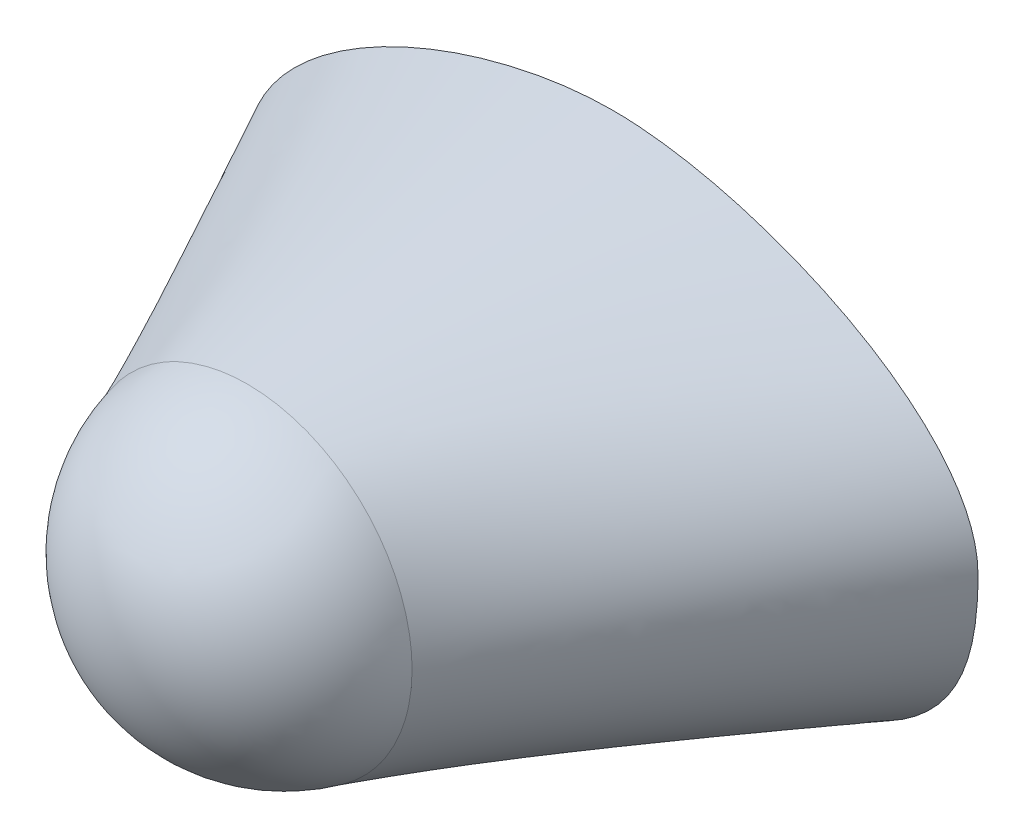
ISO-10303-21;
HEADER;
FILE_DESCRIPTION(('STEP AP214'),'2;1');
FILE_NAME('part.step','',(''),(''),'','','');
FILE_SCHEMA(('AUTOMOTIVE_DESIGN { 1 0 10303 214 1 1 1 1 }'));
ENDSEC;
DATA;
#1=APPLICATION_CONTEXT('core data for automotive mechanical design processes');
#2=APPLICATION_PROTOCOL_DEFINITION('international standard','automotive_design',2000,#1);
#3=PRODUCT_CONTEXT('',#1,'mechanical');
#4=PRODUCT('Part','Part','',(#3));
#5=PRODUCT_RELATED_PRODUCT_CATEGORY('part','',(#4));
#6=PRODUCT_DEFINITION_FORMATION('','',#4);
#7=PRODUCT_DEFINITION_CONTEXT('part definition',#1,'design');
#8=PRODUCT_DEFINITION('design','',#6,#7);
#9=PRODUCT_DEFINITION_SHAPE('','',#8);
#10=(LENGTH_UNIT() NAMED_UNIT(*) SI_UNIT(.MILLI.,.METRE.));
#11=(NAMED_UNIT(*) PLANE_ANGLE_UNIT() SI_UNIT($,.RADIAN.));
#12=(NAMED_UNIT(*) SI_UNIT($,.STERADIAN.) SOLID_ANGLE_UNIT());
#13=UNCERTAINTY_MEASURE_WITH_UNIT(LENGTH_MEASURE(1.E-05),#10,'distance_accuracy_value','');
#14=(GEOMETRIC_REPRESENTATION_CONTEXT(3) GLOBAL_UNCERTAINTY_ASSIGNED_CONTEXT((#13)) GLOBAL_UNIT_ASSIGNED_CONTEXT((#10,
#11,#12)) REPRESENTATION_CONTEXT('',''));
#15=CARTESIAN_POINT('',(0.,0.,0.));
#16=DIRECTION('',(0.,0.,1.));
#17=DIRECTION('',(1.,0.,0.));
#18=AXIS2_PLACEMENT_3D('',#15,#16,#17);
#19=CARTESIAN_POINT('',(-41.25,-21.25,0.));
#20=DIRECTION('',(0.,0.,-1.));
#21=DIRECTION('',(-1.,0.,0.));
#22=AXIS2_PLACEMENT_3D('',#19,#20,#21);
#23=PLANE('',#22);
#24=CARTESIAN_POINT('',(-50.,0.,0.));
#25=CARTESIAN_POINT('',(-50.,-16.6666666666667,0.));
#26=CARTESIAN_POINT('',(-43.3333333333334,-30.,0.));
#27=CARTESIAN_POINT('',(0.,-30.,0.));
#28=B_SPLINE_CURVE_WITH_KNOTS('',3,(#24,#25,#26,#27),.UNSPECIFIED.,.F.,.F.,(4,4),(0.,1.),.UNSPECIFIED.);
#29=CARTESIAN_POINT('',(-50.,0.,0.));
#30=VERTEX_POINT('',#29);
#31=CARTESIAN_POINT('',(0.,-30.,0.));
#32=VERTEX_POINT('',#31);
#33=EDGE_CURVE('E147',#30,#32,#28,.T.);
#34=ORIENTED_EDGE('',*,*,#33,.F.);
#35=CARTESIAN_POINT('',(0.,30.,0.));
#36=CARTESIAN_POINT('',(-20.,30.,0.));
#37=CARTESIAN_POINT('',(-50.,16.6666666666667,0.));
#38=CARTESIAN_POINT('',(-50.,0.,0.));
#39=B_SPLINE_CURVE_WITH_KNOTS('',3,(#35,#36,#37,#38),.UNSPECIFIED.,.F.,.F.,(4,4),(0.,1.),.UNSPECIFIED.);
#40=CARTESIAN_POINT('',(0.,30.,0.));
#41=VERTEX_POINT('',#40);
#42=EDGE_CURVE('E125',#41,#30,#39,.T.);
#43=ORIENTED_EDGE('',*,*,#42,.F.);
#44=CARTESIAN_POINT('',(50.,0.,0.));
#45=CARTESIAN_POINT('',(50.,16.6666666666667,0.));
#46=CARTESIAN_POINT('',(20.,30.,0.));
#47=CARTESIAN_POINT('',(0.,30.,0.));
#48=B_SPLINE_CURVE_WITH_KNOTS('',3,(#44,#45,#46,#47),.UNSPECIFIED.,.F.,.F.,(4,4),(0.,1.),.UNSPECIFIED.);
#49=CARTESIAN_POINT('',(50.,0.,0.));
#50=VERTEX_POINT('',#49);
#51=EDGE_CURVE('E138',#50,#41,#48,.T.);
#52=ORIENTED_EDGE('',*,*,#51,.F.);
#53=CARTESIAN_POINT('',(0.,-30.,0.));
#54=CARTESIAN_POINT('',(43.3333333333333,-30.,0.));
#55=CARTESIAN_POINT('',(50.,-16.6666666666667,0.));
#56=CARTESIAN_POINT('',(50.,0.,0.));
#57=B_SPLINE_CURVE_WITH_KNOTS('',3,(#53,#54,#55,#56),.UNSPECIFIED.,.F.,.F.,(4,4),(0.,1.),.UNSPECIFIED.);
#58=EDGE_CURVE('E132',#32,#50,#57,.T.);
#59=ORIENTED_EDGE('',*,*,#58,.F.);
#60=EDGE_LOOP('',(#34,#43,#52,#59));
#61=FACE_BOUND('',#60,.T.);
#62=ADVANCED_FACE('F113',(#61),#23,.T.);
#63=CARTESIAN_POINT('',(0.,0.,44.8864291819027));
#64=DIRECTION('',(0.,0.,1.));
#65=DIRECTION('',(1.,0.,0.));
#66=AXIS2_PLACEMENT_3D('',#63,#64,#65);
#67=SPHERICAL_SURFACE('',#66,23.1135708180973);
#68=CARTESIAN_POINT('',(0.,22.5408196268792,50.));
#69=CARTESIAN_POINT('',(0.737644811279513,22.5408196268792,50.));
#70=CARTESIAN_POINT('',(2.21437796444021,22.4681569114567,50.));
#71=CARTESIAN_POINT('',(5.1439601985741,22.0336363053824,49.9999999999999));
#72=CARTESIAN_POINT('',(8.70554624102578,20.9509740063478,50.0000000000001));
#73=CARTESIAN_POINT('',(11.9888337267071,19.1891748900761,49.9999999999999));
#74=CARTESIAN_POINT('',(14.3689406879445,17.4145294677336,50.));
#75=CARTESIAN_POINT('',(16.0136706848358,15.9155830791882,50.0000000000001));
#76=CARTESIAN_POINT('',(17.5009617473077,14.2633151117285,50.));
#77=CARTESIAN_POINT('',(18.8173782540881,12.4756131140643,49.9999999999999));
#78=CARTESIAN_POINT('',(19.9494845839051,10.5703646349054,50.));
#79=CARTESIAN_POINT('',(20.8881449046688,8.5677284560601,50.0000000000001));
#80=CARTESIAN_POINT('',(21.6242233842895,6.48786335933677,50.));
#81=CARTESIAN_POINT('',(22.1531531817402,4.35213875473807,50.));
#82=CARTESIAN_POINT('',(22.4703674559941,2.18192405226671,50.));
#83=CARTESIAN_POINT('',(22.5408196268792,0.726385400898738,50.));
#84=CARTESIAN_POINT('',(22.5408196268792,-0.748907784204107,50.));
#85=CARTESIAN_POINT('',(22.4654486010122,-2.2435898693303,50.));
#86=CARTESIAN_POINT('',(22.132364478143,-4.45596328581048,50.));
#87=CARTESIAN_POINT('',(21.5853382647372,-6.61843772971852,50.));
#88=CARTESIAN_POINT('',(20.830455454327,-8.71076393969135,50.));
#89=CARTESIAN_POINT('',(19.8738015404445,-10.7126926543659,50.));
#90=CARTESIAN_POINT('',(18.7278064308159,-12.6078134680135,50.));
#91=CARTESIAN_POINT('',(17.4049000331673,-14.3797159749053,50.));
#92=CARTESIAN_POINT('',(15.9175122552248,-16.0119897693125,50.));
#93=CARTESIAN_POINT('',(14.2780730047146,-17.4882244455064,50.));
#94=CARTESIAN_POINT('',(12.5035731057525,-18.7972163159201,50.));
#95=CARTESIAN_POINT('',(10.6110033824544,-19.9277616929869,50.));
#96=CARTESIAN_POINT('',(8.61735465893626,-20.86865688914,50.));
#97=CARTESIAN_POINT('',(6.53961775931389,-21.6086982168125,50.));
#98=CARTESIAN_POINT('',(4.39768049848067,-22.1432540775056,50.));
#99=CARTESIAN_POINT('',(2.21143069132996,-22.4676928727206,50.));
#100=CARTESIAN_POINT('',(0.737647665613404,-22.5408196268792,50.));
#101=CARTESIAN_POINT('',(-0.737645519489444,-22.5408196268792,50.));
#102=CARTESIAN_POINT('',(-2.21142519361695,-22.4676932333094,50.));
#103=CARTESIAN_POINT('',(-4.39767237847218,-22.1432555495667,50.));
#104=CARTESIAN_POINT('',(-6.53960900520946,-21.6087008597579,50.));
#105=CARTESIAN_POINT('',(-8.61734684204688,-20.8686602512047,50.));
#106=CARTESIAN_POINT('',(-10.6109976572025,-19.9277648112287,50.));
#107=CARTESIAN_POINT('',(-12.5035701520002,-18.7972183263901,50.));
#108=CARTESIAN_POINT('',(-14.2780730277636,-17.4882245832486,50.));
#109=CARTESIAN_POINT('',(-15.9175149858167,-16.0119873683643,50.0000000000001));
#110=CARTESIAN_POINT('',(-17.4049047274832,-14.379710468297,50.));
#111=CARTESIAN_POINT('',(-18.727812290911,-12.6078048041808,50.));
#112=CARTESIAN_POINT('',(-19.8738077142478,-10.7126812971495,50.));
#113=CARTESIAN_POINT('',(-20.8304610356418,-8.71075086833718,50.));
#114=CARTESIAN_POINT('',(-21.5853422932406,-6.61842443887768,50.));
#115=CARTESIAN_POINT('',(-22.1323666077548,-4.45595171378586,50.));
#116=CARTESIAN_POINT('',(-22.4654490998949,-2.24358239807657,50.));
#117=CARTESIAN_POINT('',(-22.5408196268792,-0.748904930535275,50.));
#118=CARTESIAN_POINT('',(-22.5408196268792,0.726388254567558,50.));
#119=CARTESIAN_POINT('',(-22.4703669156703,2.18193149785886,50.));
#120=CARTESIAN_POINT('',(-22.153151044353,4.35215003509447,50.));
#121=CARTESIAN_POINT('',(-21.6242196976549,6.48787571445884,50.));
#122=CARTESIAN_POINT('',(-20.8881402192242,8.56773970554058,50.));
#123=CARTESIAN_POINT('',(-19.9494799527093,10.5703731779283,50.));
#124=CARTESIAN_POINT('',(-18.8173748255809,12.475618011014,50.));
#125=CARTESIAN_POINT('',(-17.5009607653094,14.2633160841896,50.));
#126=CARTESIAN_POINT('',(-16.013673096587,15.9155803992303,50.));
#127=CARTESIAN_POINT('',(-14.3689471441057,17.4145239579111,50.));
#128=CARTESIAN_POINT('',(-11.9888456571361,19.189167047456,50.0000000000001));
#129=CARTESIAN_POINT('',(-8.70556369409142,20.9509665926764,49.9999999999999));
#130=CARTESIAN_POINT('',(-5.14397671973509,22.0336327824433,50.));
#131=CARTESIAN_POINT('',(-2.21438739195095,22.4681562252586,50.));
#132=CARTESIAN_POINT('',(-0.73764837382333,22.5408196268792,50.));
#133=CARTESIAN_POINT('',(0.,22.5408196268792,50.));
#134=B_SPLINE_CURVE_WITH_KNOTS('',3,(#68,#69,#70,#71,#72,#73,#74,#75,#76,#77,#78,#79,#80,#81,
#82,#83,#84,#85,#86,#87,#88,#89,#90,#91,#92,#93,#94,#95,#96,#97,#98,#99,#100,#101,#102,#103,
#104,#105,#106,#107,#108,#109,#110,#111,#112,#113,#114,#115,#116,#117,#118,#119,#120,#121,#122,
#123,#124,#125,#126,#127,#128,#129,#130,#131,#132,#133),.UNSPECIFIED.,.T.,.F.,(4,1,1,1,1,1,1,1,
1,1,1,1,1,1,2,1,1,1,1,1,1,1,1,1,1,1,1,1,1,1,2,1,1,1,1,1,1,1,1,1,1,1,1,1,1,1,2,1,1,1,1,1,1,1,1,1,
1,1,1,1,4),(0.,0.0153864559131972,0.0307729118263944,0.0615458236527888,0.0923187354791832,
0.10770519139238,0.123091647305578,0.138478103218775,0.153864559131972,0.169251015045169,
0.184637470958366,0.200023926871564,0.215410382784761,0.230796838697958,0.246183294611155,
0.262046824619398,0.277910354627641,0.293773884635884,0.309637414644127,0.32550094465237,
0.341364474660613,0.357228004668856,0.373091534677099,0.388955064685342,0.404818594693584,
0.420682124701828,0.43654565471007,0.452409184718313,0.468272714726556,0.484136244734799,
0.499999774743042,0.515863258597676,0.53172674245231,0.547590226306944,0.563453710161578,
0.579317194016212,0.595180677870846,0.61104416172548,0.626907645580114,0.642771129434748,
0.658634613289382,0.674498097144016,0.69036158099865,0.706225064853284,0.722088548707918,
0.737952032562552,0.753815516417186,0.769202046641112,0.784588576865038,0.799975107088963,
0.815361637312889,0.830748167536815,0.846134697760741,0.861521227984667,0.876907758208593,
0.892294288432519,0.907680818656445,0.938453879104296,0.969226939552148,0.984613469776074,1.),.UNSPECIFIED.);
#135=CARTESIAN_POINT('',(22.5408196268792,0.,50.));
#136=VERTEX_POINT('',#135);
#137=EDGE_CURVE('E12',#136,#136,#134,.F.);
#138=ORIENTED_EDGE('',*,*,#137,.T.);
#139=EDGE_LOOP('',(#138));
#140=FACE_BOUND('',#139,.T.);
#141=ADVANCED_FACE('F115',(#140),#67,.T.);
#142=CARTESIAN_POINT('',(0.,22.5408196268792,50.));
#143=CARTESIAN_POINT('',(6.42063847575147E-06,30.,0.));
#144=CARTESIAN_POINT('',(0.737644811279513,22.5408196268792,50.));
#145=CARTESIAN_POINT('',(1.30819447119022,30.,0.));
#146=CARTESIAN_POINT('',(2.21437796444021,22.4681569114567,50.));
#147=CARTESIAN_POINT('',(3.9215055633012,29.8873090495135,0.));
#148=CARTESIAN_POINT('',(5.1439601985741,22.0336363053824,49.9999999999999));
#149=CARTESIAN_POINT('',(9.11057899790285,29.2968776843211,0.));
#150=CARTESIAN_POINT('',(8.70554624102578,20.9509740063478,50.0000000000001));
#151=CARTESIAN_POINT('',(15.4997603418307,27.9874469704057,0.));
#152=CARTESIAN_POINT('',(11.9888337267071,19.1891748900761,49.9999999999999));
#153=CARTESIAN_POINT('',(21.7191572458839,26.0517141142838,0.));
#154=CARTESIAN_POINT('',(14.3689406879445,17.4145294677336,50.));
#155=CARTESIAN_POINT('',(26.5643531211174,24.1398610046672,0.));
#156=CARTESIAN_POINT('',(16.0136706848358,15.9155830791882,50.0000000000001));
#157=CARTESIAN_POINT('',(30.1205839565339,22.5177488471528,0.));
#158=CARTESIAN_POINT('',(17.5009617473077,14.2633151117285,50.));
#159=CARTESIAN_POINT('',(33.5838829636102,20.6965018154544,0.));
#160=CARTESIAN_POINT('',(18.8173782540881,12.4756131140643,49.9999999999999));
#161=CARTESIAN_POINT('',(36.929900745263,18.6573807291014,0.));
#162=CARTESIAN_POINT('',(19.9494845839051,10.5703646349054,50.));
#163=CARTESIAN_POINT('',(40.1235421421309,16.3736060025542,0.));
#164=CARTESIAN_POINT('',(20.8881449046688,8.5677284560601,50.0000000000001));
#165=CARTESIAN_POINT('',(43.1084295571916,13.8088322462493,0.));
#166=CARTESIAN_POINT('',(21.6242233842895,6.48786335933677,50.));
#167=CARTESIAN_POINT('',(45.7964006433035,10.9162168874978,0.));
#168=CARTESIAN_POINT('',(22.1531531817402,4.35213875473807,50.));
#169=CARTESIAN_POINT('',(48.0398088265826,7.64706977446811,0.));
#170=CARTESIAN_POINT('',(22.4703674559941,2.18192405226671,50.));
#171=CARTESIAN_POINT('',(49.6099754411586,3.97838801389557,0.));
#172=CARTESIAN_POINT('',(22.5408196268792,0.726385400898738,50.));
#173=CARTESIAN_POINT('',(50.,1.32879155769658,0.));
#174=CARTESIAN_POINT('',(22.5408196268792,-0.748907784204107,50.));
#175=CARTESIAN_POINT('',(50.,-1.36999500600349,0.));
#176=CARTESIAN_POINT('',(22.4654486010122,-2.2435898693303,50.));
#177=CARTESIAN_POINT('',(49.910780689395,-4.11571752979584,0.));
#178=CARTESIAN_POINT('',(22.132364478143,-4.45596328581048,50.));
#179=CARTESIAN_POINT('',(49.3638141341544,-8.21800851205794,0.));
#180=CARTESIAN_POINT('',(21.5853382647372,-6.61843772971852,50.));
#181=CARTESIAN_POINT('',(48.2327542254143,-12.2190566620016,0.));
#182=CARTESIAN_POINT('',(20.830455454327,-8.71076393969135,50.));
#183=CARTESIAN_POINT('',(46.368421400269,-15.9567663770109,0.));
#184=CARTESIAN_POINT('',(19.8738015404445,-10.7126926543659,50.));
#185=CARTESIAN_POINT('',(43.7530686539479,-19.2279434824748,0.));
#186=CARTESIAN_POINT('',(18.7278064308159,-12.6078134680135,50.));
#187=CARTESIAN_POINT('',(40.5374656460695,-21.9152956744316,0.));
#188=CARTESIAN_POINT('',(17.4049000331673,-14.3797159749053,50.));
#189=CARTESIAN_POINT('',(36.925211570575,-24.0398397723613,0.));
#190=CARTESIAN_POINT('',(15.9175122552248,-16.0119897693125,50.));
#191=CARTESIAN_POINT('',(33.0722587665061,-25.6906507116494,0.));
#192=CARTESIAN_POINT('',(14.2780730047146,-17.4882244455064,50.));
#193=CARTESIAN_POINT('',(29.0768213081922,-26.9627470971944,0.));
#194=CARTESIAN_POINT('',(12.5035731057525,-18.7972163159201,50.));
#195=CARTESIAN_POINT('',(24.9969070100984,-27.934984221321,0.));
#196=CARTESIAN_POINT('',(10.6110033824544,-19.9277616929869,50.));
#197=CARTESIAN_POINT('',(20.8671032929551,-28.6679821166644,0.));
#198=CARTESIAN_POINT('',(8.61735465893626,-20.86865688914,50.));
#199=CARTESIAN_POINT('',(16.7085393313414,-29.2074563629032,0.));
#200=CARTESIAN_POINT('',(6.53961775931389,-21.6086982168125,50.));
#201=CARTESIAN_POINT('',(12.5347209187431,-29.5880037149686,0.));
#202=CARTESIAN_POINT('',(4.39768049848067,-22.1432540775056,50.));
#203=CARTESIAN_POINT('',(8.35459723486195,-29.8361654384099,0.));
#204=CARTESIAN_POINT('',(2.21143069132996,-22.4676928727206,50.));
#205=CARTESIAN_POINT('',(4.17440540329901,-29.9726028932739,0.));
#206=CARTESIAN_POINT('',(0.737647665613404,-22.5408196268792,50.));
#207=CARTESIAN_POINT('',(1.39059343008345,-30.,0.));
#208=CARTESIAN_POINT('',(-0.737645519489444,-22.5408196268792,50.));
#209=CARTESIAN_POINT('',(-1.39059738779776,-30.,0.));
#210=CARTESIAN_POINT('',(-2.21142519361695,-22.4676932333094,50.));
#211=CARTESIAN_POINT('',(-4.17441247675228,-29.9726029770549,0.));
#212=CARTESIAN_POINT('',(-4.39767237847218,-22.1432555495667,50.));
#213=CARTESIAN_POINT('',(-8.35460805517754,-29.8361646086772,0.));
#214=CARTESIAN_POINT('',(-6.53960900520946,-21.6087008597579,50.));
#215=CARTESIAN_POINT('',(-12.5347273401342,-29.5880038380901,0.));
#216=CARTESIAN_POINT('',(-8.61734684204688,-20.8686602512047,50.));
#217=CARTESIAN_POINT('',(-16.7085420065058,-29.2074548407059,0.));
#218=CARTESIAN_POINT('',(-10.6109976572025,-19.9277648112287,50.));
#219=CARTESIAN_POINT('',(-20.8671048298764,-28.6679824847477,0.));
#220=CARTESIAN_POINT('',(-12.5035701520002,-18.7972183263901,50.));
#221=CARTESIAN_POINT('',(-24.996903012786,-27.9349846258915,0.));
#222=CARTESIAN_POINT('',(-14.2780730277636,-17.4882245832486,50.));
#223=CARTESIAN_POINT('',(-29.0768121893758,-26.9627496101297,0.));
#224=CARTESIAN_POINT('',(-15.9175149858167,-16.0119873683643,50.0000000000001));
#225=CARTESIAN_POINT('',(-33.0722438907207,-25.6906558793757,0.));
#226=CARTESIAN_POINT('',(-17.4049047274832,-14.379710468297,50.));
#227=CARTESIAN_POINT('',(-36.925192187015,-24.0398492263361,0.));
#228=CARTESIAN_POINT('',(-18.727812290911,-12.6078048041808,50.));
#229=CARTESIAN_POINT('',(-40.5374437053159,-21.9153105942377,0.));
#230=CARTESIAN_POINT('',(-19.8738077142478,-10.7126812971495,50.));
#231=CARTESIAN_POINT('',(-43.7530475247281,-19.2279646635696,0.));
#232=CARTESIAN_POINT('',(-20.8304610356418,-8.71075086833718,50.));
#233=CARTESIAN_POINT('',(-46.3684047460925,-15.9567925090648,0.));
#234=CARTESIAN_POINT('',(-21.5853422932406,-6.61842443887768,50.));
#235=CARTESIAN_POINT('',(-48.2327441025325,-12.2190840395323,0.));
#236=CARTESIAN_POINT('',(-22.1323666077548,-4.45595171378586,50.));
#237=CARTESIAN_POINT('',(-49.3638098248742,-8.21803186673036,0.));
#238=CARTESIAN_POINT('',(-22.4654490998949,-2.24358239807657,50.));
#239=CARTESIAN_POINT('',(-49.9107799707077,-4.11573227795068,0.));
#240=CARTESIAN_POINT('',(-22.5408196268792,-0.748904930535275,50.));
#241=CARTESIAN_POINT('',(-50.,-1.37000013950113,0.));
#242=CARTESIAN_POINT('',(-22.5408196268792,0.726388254567558,50.));
#243=CARTESIAN_POINT('',(-50.,1.32878612903696,0.));
#244=CARTESIAN_POINT('',(-22.4703669156703,2.18193149785886,50.));
#245=CARTESIAN_POINT('',(-49.609978612603,3.97837417941633,0.));
#246=CARTESIAN_POINT('',(-22.153151044353,4.35215003509447,50.));
#247=CARTESIAN_POINT('',(-48.0398189532155,7.64705124904566,0.));
#248=CARTESIAN_POINT('',(-21.6242196976549,6.48787571445884,50.));
#249=CARTESIAN_POINT('',(-45.7964152442627,10.9161989154926,0.));
#250=CARTESIAN_POINT('',(-20.8881402192242,8.56773970554058,50.));
#251=CARTESIAN_POINT('',(-43.1084450804444,13.8088176438933,0.));
#252=CARTESIAN_POINT('',(-19.9494799527093,10.5703731779283,50.));
#253=CARTESIAN_POINT('',(-40.1235552138969,16.3735960389281,0.));
#254=CARTESIAN_POINT('',(-18.8173748255809,12.475618011014,50.));
#255=CARTESIAN_POINT('',(-36.9299087055268,18.6573757223396,0.));
#256=CARTESIAN_POINT('',(-17.5009607653094,14.2633160841896,50.));
#257=CARTESIAN_POINT('',(-33.5838839490006,20.6965014695589,0.));
#258=CARTESIAN_POINT('',(-16.013673096587,15.9155803992303,50.));
#259=CARTESIAN_POINT('',(-30.1205769683946,22.5177524520258,0.));
#260=CARTESIAN_POINT('',(-14.3689471441057,17.4145239579111,50.));
#261=CARTESIAN_POINT('',(-26.564338014088,24.1398675702959,0.));
#262=CARTESIAN_POINT('',(-11.9888456571361,19.189167047456,50.0000000000001));
#263=CARTESIAN_POINT('',(-21.7191322858204,26.0517230633811,0.));
#264=CARTESIAN_POINT('',(-8.70556369409142,20.9509665926764,49.9999999999999));
#265=CARTESIAN_POINT('',(-15.4997270593664,27.9874557317997,0.));
#266=CARTESIAN_POINT('',(-5.14397671973509,22.0336327824433,50.));
#267=CARTESIAN_POINT('',(-9.1105487398345,29.2968823879128,0.));
#268=CARTESIAN_POINT('',(-2.21438739195095,22.4681562252586,50.));
#269=CARTESIAN_POINT('',(-3.9214883519311,29.8873101285734,0.));
#270=CARTESIAN_POINT('',(-0.73764837382333,22.5408196268792,50.));
#271=CARTESIAN_POINT('',(-1.30818794796389,30.,0.));
#272=CARTESIAN_POINT('',(0.,22.5408196268792,50.));
#273=CARTESIAN_POINT('',(6.42063847575147E-06,30.,0.));
#274=B_SPLINE_SURFACE_WITH_KNOTS('',3,1,((#142,#143),(#144,#145),(#146,#147),(#148,#149),(#150,
#151),(#152,#153),(#154,#155),(#156,#157),(#158,#159),(#160,#161),(#162,#163),(#164,#165),(#166,
#167),(#168,#169),(#170,#171),(#172,#173),(#174,#175),(#176,#177),(#178,#179),(#180,#181),(#182,
#183),(#184,#185),(#186,#187),(#188,#189),(#190,#191),(#192,#193),(#194,#195),(#196,#197),(#198,
#199),(#200,#201),(#202,#203),(#204,#205),(#206,#207),(#208,#209),(#210,#211),(#212,#213),(#214,
#215),(#216,#217),(#218,#219),(#220,#221),(#222,#223),(#224,#225),(#226,#227),(#228,#229),(#230,
#231),(#232,#233),(#234,#235),(#236,#237),(#238,#239),(#240,#241),(#242,#243),(#244,#245),(#246,
#247),(#248,#249),(#250,#251),(#252,#253),(#254,#255),(#256,#257),(#258,#259),(#260,#261),(#262,
#263),(#264,#265),(#266,#267),(#268,#269),(#270,#271),(#272,#273)),.UNSPECIFIED.,.T.,.F.,.F.,(4,
1,1,1,1,1,1,1,1,1,1,1,1,1,2,1,1,1,1,1,1,1,1,1,1,1,1,1,1,1,2,1,1,1,1,1,1,1,1,1,1,1,1,1,1,1,2,1,1,
1,1,1,1,1,1,1,1,1,1,1,4),(2,2),(0.,0.0153864559131972,0.0307729118263944,0.0615458236527888,
0.0923187354791832,0.10770519139238,0.123091647305578,0.138478103218775,0.153864559131972,
0.169251015045169,0.184637470958366,0.200023926871564,0.215410382784761,0.230796838697958,
0.246183294611155,0.262046824619398,0.277910354627641,0.293773884635884,0.309637414644127,
0.32550094465237,0.341364474660613,0.357228004668856,0.373091534677099,0.388955064685342,
0.404818594693584,0.420682124701828,0.43654565471007,0.452409184718313,0.468272714726556,
0.484136244734799,0.499999774743042,0.515863258597676,0.53172674245231,0.547590226306944,
0.563453710161578,0.579317194016212,0.595180677870846,0.61104416172548,0.626907645580114,
0.642771129434748,0.658634613289382,0.674498097144016,0.69036158099865,0.706225064853284,
0.722088548707918,0.737952032562552,0.753815516417186,0.769202046641112,0.784588576865038,
0.799975107088963,0.815361637312889,0.830748167536815,0.846134697760741,0.861521227984667,
0.876907758208593,0.892294288432519,0.907680818656445,0.938453879104296,0.969226939552148,
0.984613469776074,1.),(0.,1.),.UNSPECIFIED.);
#275=ORIENTED_EDGE('',*,*,#137,.F.);
#276=EDGE_LOOP('',(#275));
#277=FACE_BOUND('',#276,.T.);
#278=ORIENTED_EDGE('',*,*,#42,.T.);
#279=ORIENTED_EDGE('',*,*,#33,.T.);
#280=ORIENTED_EDGE('',*,*,#58,.T.);
#281=ORIENTED_EDGE('',*,*,#51,.T.);
#282=EDGE_LOOP('',(#278,#279,#280,#281));
#283=FACE_BOUND('',#282,.T.);
#284=ADVANCED_FACE('F146',(#277,#283),#274,.T.);
#285=CLOSED_SHELL('',(#62,#141,#284));
#286=MANIFOLD_SOLID_BREP('B2',#285);
#287=ADVANCED_BREP_SHAPE_REPRESENTATION('',(#18,#286),#14);
#288=SHAPE_DEFINITION_REPRESENTATION(#9,#287);
ENDSEC;
END-ISO-10303-21;
